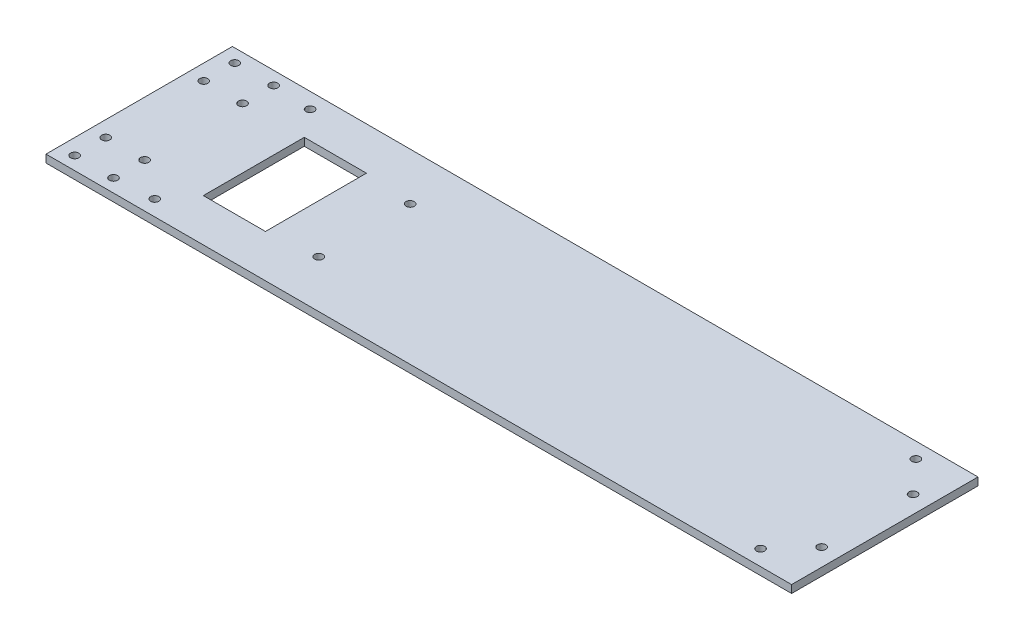
ISO-10303-21;
HEADER;
FILE_DESCRIPTION(('STEP AP214'),'2;1');
FILE_NAME('part.step','',(''),(''),'','','');
FILE_SCHEMA(('AUTOMOTIVE_DESIGN { 1 0 10303 214 1 1 1 1 }'));
ENDSEC;
DATA;
#1=APPLICATION_CONTEXT('core data for automotive mechanical design processes');
#2=APPLICATION_PROTOCOL_DEFINITION('international standard','automotive_design',2000,#1);
#3=PRODUCT_CONTEXT('',#1,'mechanical');
#4=PRODUCT('Part','Part','',(#3));
#5=PRODUCT_RELATED_PRODUCT_CATEGORY('part','',(#4));
#6=PRODUCT_DEFINITION_FORMATION('','',#4);
#7=PRODUCT_DEFINITION_CONTEXT('part definition',#1,'design');
#8=PRODUCT_DEFINITION('design','',#6,#7);
#9=PRODUCT_DEFINITION_SHAPE('','',#8);
#10=(LENGTH_UNIT() NAMED_UNIT(*) SI_UNIT(.MILLI.,.METRE.));
#11=(NAMED_UNIT(*) PLANE_ANGLE_UNIT() SI_UNIT($,.RADIAN.));
#12=(NAMED_UNIT(*) SI_UNIT($,.STERADIAN.) SOLID_ANGLE_UNIT());
#13=UNCERTAINTY_MEASURE_WITH_UNIT(LENGTH_MEASURE(1.E-05),#10,'distance_accuracy_value','');
#14=(GEOMETRIC_REPRESENTATION_CONTEXT(3) GLOBAL_UNCERTAINTY_ASSIGNED_CONTEXT((#13)) GLOBAL_UNIT_ASSIGNED_CONTEXT((#10,
#11,#12)) REPRESENTATION_CONTEXT('',''));
#15=CARTESIAN_POINT('',(0.,0.,0.));
#16=DIRECTION('',(0.,0.,1.));
#17=DIRECTION('',(1.,0.,0.));
#18=AXIS2_PLACEMENT_3D('',#15,#16,#17);
#19=CARTESIAN_POINT('',(0.,6.35,0.));
#20=DIRECTION('',(1.,0.,0.));
#21=DIRECTION('',(0.,0.,-1.));
#22=AXIS2_PLACEMENT_3D('',#19,#20,#21);
#23=PLANE('',#22);
#24=DIRECTION('',(0.,0.,1.));
#25=VECTOR('',#24,1.);
#26=CARTESIAN_POINT('',(0.,0.,0.));
#27=LINE('',#26,#25);
#28=CARTESIAN_POINT('',(0.,0.,-152.4));
#29=VERTEX_POINT('',#28);
#30=CARTESIAN_POINT('',(0.,0.,0.));
#31=VERTEX_POINT('',#30);
#32=EDGE_CURVE('E103',#29,#31,#27,.T.);
#33=ORIENTED_EDGE('',*,*,#32,.T.);
#34=DIRECTION('',(0.,-1.,0.));
#35=VECTOR('',#34,1.);
#36=CARTESIAN_POINT('',(0.,6.35,0.));
#37=LINE('',#36,#35);
#38=CARTESIAN_POINT('',(0.,6.35,0.));
#39=VERTEX_POINT('',#38);
#40=EDGE_CURVE('E11',#39,#31,#37,.T.);
#41=ORIENTED_EDGE('',*,*,#40,.F.);
#42=DIRECTION('',(0.,0.,1.));
#43=VECTOR('',#42,1.);
#44=CARTESIAN_POINT('',(0.,6.35,0.));
#45=LINE('',#44,#43);
#46=CARTESIAN_POINT('',(0.,6.35,-152.4));
#47=VERTEX_POINT('',#46);
#48=EDGE_CURVE('E132',#47,#39,#45,.T.);
#49=ORIENTED_EDGE('',*,*,#48,.F.);
#50=DIRECTION('',(0.,-1.,0.));
#51=VECTOR('',#50,1.);
#52=CARTESIAN_POINT('',(0.,6.35,-152.4));
#53=LINE('',#52,#51);
#54=EDGE_CURVE('E142',#47,#29,#53,.T.);
#55=ORIENTED_EDGE('',*,*,#54,.T.);
#56=EDGE_LOOP('',(#33,#41,#49,#55));
#57=FACE_BOUND('',#56,.T.);
#58=ADVANCED_FACE('F33',(#57),#23,.F.);
#59=CARTESIAN_POINT('',(0.,6.35,0.));
#60=DIRECTION('',(0.,0.,-1.));
#61=DIRECTION('',(-1.,0.,0.));
#62=AXIS2_PLACEMENT_3D('',#59,#60,#61);
#63=PLANE('',#62);
#64=DIRECTION('',(1.,0.,0.));
#65=VECTOR('',#64,1.);
#66=CARTESIAN_POINT('',(0.,0.,0.));
#67=LINE('',#66,#65);
#68=CARTESIAN_POINT('',(609.6,0.,0.));
#69=VERTEX_POINT('',#68);
#70=EDGE_CURVE('E145',#31,#69,#67,.T.);
#71=ORIENTED_EDGE('',*,*,#70,.T.);
#72=DIRECTION('',(0.,-1.,0.));
#73=VECTOR('',#72,1.);
#74=CARTESIAN_POINT('',(609.6,6.35,0.));
#75=LINE('',#74,#73);
#76=CARTESIAN_POINT('',(609.6,6.35,0.));
#77=VERTEX_POINT('',#76);
#78=EDGE_CURVE('E40',#77,#69,#75,.T.);
#79=ORIENTED_EDGE('',*,*,#78,.F.);
#80=DIRECTION('',(1.,0.,0.));
#81=VECTOR('',#80,1.);
#82=CARTESIAN_POINT('',(0.,6.35,0.));
#83=LINE('',#82,#81);
#84=EDGE_CURVE('E135',#39,#77,#83,.T.);
#85=ORIENTED_EDGE('',*,*,#84,.F.);
#86=ORIENTED_EDGE('',*,*,#40,.T.);
#87=EDGE_LOOP('',(#71,#79,#85,#86));
#88=FACE_BOUND('',#87,.T.);
#89=ADVANCED_FACE('F173',(#88),#63,.F.);
#90=CARTESIAN_POINT('',(609.6,6.35,0.));
#91=DIRECTION('',(-1.,0.,0.));
#92=DIRECTION('',(0.,0.,1.));
#93=AXIS2_PLACEMENT_3D('',#90,#91,#92);
#94=PLANE('',#93);
#95=DIRECTION('',(0.,0.,-1.));
#96=VECTOR('',#95,1.);
#97=CARTESIAN_POINT('',(609.6,0.,0.));
#98=LINE('',#97,#96);
#99=CARTESIAN_POINT('',(609.6,0.,-152.4));
#100=VERTEX_POINT('',#99);
#101=EDGE_CURVE('E147',#69,#100,#98,.T.);
#102=ORIENTED_EDGE('',*,*,#101,.T.);
#103=DIRECTION('',(0.,-1.,0.));
#104=VECTOR('',#103,1.);
#105=CARTESIAN_POINT('',(609.6,6.35,-152.4));
#106=LINE('',#105,#104);
#107=CARTESIAN_POINT('',(609.6,6.35,-152.4));
#108=VERTEX_POINT('',#107);
#109=EDGE_CURVE('E152',#108,#100,#106,.T.);
#110=ORIENTED_EDGE('',*,*,#109,.F.);
#111=DIRECTION('',(0.,0.,-1.));
#112=VECTOR('',#111,1.);
#113=CARTESIAN_POINT('',(609.6,6.35,0.));
#114=LINE('',#113,#112);
#115=EDGE_CURVE('E138',#77,#108,#114,.T.);
#116=ORIENTED_EDGE('',*,*,#115,.F.);
#117=ORIENTED_EDGE('',*,*,#78,.T.);
#118=EDGE_LOOP('',(#102,#110,#116,#117));
#119=FACE_BOUND('',#118,.T.);
#120=ADVANCED_FACE('F159',(#119),#94,.F.);
#121=CARTESIAN_POINT('',(0.,6.35,-152.4));
#122=DIRECTION('',(0.,0.,1.));
#123=DIRECTION('',(1.,0.,0.));
#124=AXIS2_PLACEMENT_3D('',#121,#122,#123);
#125=PLANE('',#124);
#126=DIRECTION('',(-1.,0.,0.));
#127=VECTOR('',#126,1.);
#128=CARTESIAN_POINT('',(0.,0.,-152.4));
#129=LINE('',#128,#127);
#130=EDGE_CURVE('E136',#100,#29,#129,.T.);
#131=ORIENTED_EDGE('',*,*,#130,.T.);
#132=ORIENTED_EDGE('',*,*,#54,.F.);
#133=DIRECTION('',(-1.,0.,0.));
#134=VECTOR('',#133,1.);
#135=CARTESIAN_POINT('',(0.,6.35,-152.4));
#136=LINE('',#135,#134);
#137=EDGE_CURVE('E140',#108,#47,#136,.T.);
#138=ORIENTED_EDGE('',*,*,#137,.F.);
#139=ORIENTED_EDGE('',*,*,#109,.T.);
#140=EDGE_LOOP('',(#131,#132,#138,#139));
#141=FACE_BOUND('',#140,.T.);
#142=ADVANCED_FACE('F166',(#141),#125,.F.);
#143=CARTESIAN_POINT('',(0.,6.35,0.));
#144=DIRECTION('',(0.,-1.,0.));
#145=DIRECTION('',(0.,0.,-1.));
#146=AXIS2_PLACEMENT_3D('',#143,#144,#145);
#147=PLANE('',#146);
#148=CARTESIAN_POINT('',(44.45,6.35,-141.65072));
#149=DIRECTION('',(0.,1.,0.));
#150=DIRECTION('',(0.,0.,1.));
#151=AXIS2_PLACEMENT_3D('',#148,#149,#150);
#152=CIRCLE('',#151,3.37819999999998);
#153=CARTESIAN_POINT('',(44.45,6.35,-138.27252));
#154=VERTEX_POINT('',#153);
#155=EDGE_CURVE('E272',#154,#154,#152,.T.);
#156=ORIENTED_EDGE('',*,*,#155,.F.);
#157=EDGE_LOOP('',(#156));
#158=FACE_BOUND('',#157,.T.);
#159=CARTESIAN_POINT('',(44.45,6.35,-116.25072));
#160=DIRECTION('',(0.,1.,0.));
#161=DIRECTION('',(0.,0.,1.));
#162=AXIS2_PLACEMENT_3D('',#159,#160,#161);
#163=CIRCLE('',#162,3.37819999999998);
#164=CARTESIAN_POINT('',(44.45,6.35,-112.87252));
#165=VERTEX_POINT('',#164);
#166=EDGE_CURVE('E274',#165,#165,#163,.T.);
#167=ORIENTED_EDGE('',*,*,#166,.F.);
#168=EDGE_LOOP('',(#167));
#169=FACE_BOUND('',#168,.T.);
#170=CARTESIAN_POINT('',(12.7,6.35,-116.25072));
#171=DIRECTION('',(0.,1.,0.));
#172=DIRECTION('',(0.,0.,1.));
#173=AXIS2_PLACEMENT_3D('',#170,#171,#172);
#174=CIRCLE('',#173,3.37820000000002);
#175=CARTESIAN_POINT('',(12.7,6.35,-112.87252));
#176=VERTEX_POINT('',#175);
#177=EDGE_CURVE('E280',#176,#176,#174,.T.);
#178=ORIENTED_EDGE('',*,*,#177,.F.);
#179=EDGE_LOOP('',(#178));
#180=FACE_BOUND('',#179,.T.);
#181=CARTESIAN_POINT('',(12.7,6.35,-141.65072));
#182=DIRECTION('',(0.,1.,0.));
#183=DIRECTION('',(0.,0.,1.));
#184=AXIS2_PLACEMENT_3D('',#181,#182,#183);
#185=CIRCLE('',#184,3.37819999999999);
#186=CARTESIAN_POINT('',(12.7,6.35,-138.27252));
#187=VERTEX_POINT('',#186);
#188=EDGE_CURVE('E286',#187,#187,#185,.T.);
#189=ORIENTED_EDGE('',*,*,#188,.F.);
#190=EDGE_LOOP('',(#189));
#191=FACE_BOUND('',#190,.T.);
#192=CARTESIAN_POINT('',(44.45,6.35,-36.14928));
#193=DIRECTION('',(0.,1.,0.));
#194=DIRECTION('',(0.,0.,1.));
#195=AXIS2_PLACEMENT_3D('',#192,#193,#194);
#196=CIRCLE('',#195,3.3782);
#197=CARTESIAN_POINT('',(44.45,6.35,-32.77108));
#198=VERTEX_POINT('',#197);
#199=EDGE_CURVE('E292',#198,#198,#196,.T.);
#200=ORIENTED_EDGE('',*,*,#199,.F.);
#201=EDGE_LOOP('',(#200));
#202=FACE_BOUND('',#201,.T.);
#203=CARTESIAN_POINT('',(44.45,6.35,-10.74928));
#204=DIRECTION('',(0.,1.,0.));
#205=DIRECTION('',(0.,0.,1.));
#206=AXIS2_PLACEMENT_3D('',#203,#204,#205);
#207=CIRCLE('',#206,3.3782);
#208=CARTESIAN_POINT('',(44.45,6.35,-7.37108000000001));
#209=VERTEX_POINT('',#208);
#210=EDGE_CURVE('E298',#209,#209,#207,.T.);
#211=ORIENTED_EDGE('',*,*,#210,.F.);
#212=EDGE_LOOP('',(#211));
#213=FACE_BOUND('',#212,.T.);
#214=CARTESIAN_POINT('',(12.7,6.35,-10.74928));
#215=DIRECTION('',(0.,1.,0.));
#216=DIRECTION('',(0.,0.,1.));
#217=AXIS2_PLACEMENT_3D('',#214,#215,#216);
#218=CIRCLE('',#217,3.3782);
#219=CARTESIAN_POINT('',(12.7,6.35,-7.37108));
#220=VERTEX_POINT('',#219);
#221=EDGE_CURVE('E304',#220,#220,#218,.T.);
#222=ORIENTED_EDGE('',*,*,#221,.F.);
#223=EDGE_LOOP('',(#222));
#224=FACE_BOUND('',#223,.T.);
#225=CARTESIAN_POINT('',(12.7,6.35,-36.14928));
#226=DIRECTION('',(0.,1.,0.));
#227=DIRECTION('',(0.,0.,1.));
#228=AXIS2_PLACEMENT_3D('',#225,#226,#227);
#229=CIRCLE('',#228,3.3782);
#230=CARTESIAN_POINT('',(12.7,6.35,-32.77108));
#231=VERTEX_POINT('',#230);
#232=EDGE_CURVE('E310',#231,#231,#229,.T.);
#233=ORIENTED_EDGE('',*,*,#232,.F.);
#234=EDGE_LOOP('',(#233));
#235=FACE_BOUND('',#234,.T.);
#236=CARTESIAN_POINT('',(184.15,6.35,-113.587796728268));
#237=DIRECTION('',(0.,1.,0.));
#238=DIRECTION('',(0.,0.,1.));
#239=AXIS2_PLACEMENT_3D('',#236,#237,#238);
#240=CIRCLE('',#239,3.37819999999999);
#241=CARTESIAN_POINT('',(184.15,6.35,-110.209596728268));
#242=VERTEX_POINT('',#241);
#243=EDGE_CURVE('E316',#242,#242,#240,.T.);
#244=ORIENTED_EDGE('',*,*,#243,.F.);
#245=EDGE_LOOP('',(#244));
#246=FACE_BOUND('',#245,.T.);
#247=CARTESIAN_POINT('',(184.15,6.35,-38.812203271732));
#248=DIRECTION('',(0.,1.,0.));
#249=DIRECTION('',(0.,0.,1.));
#250=AXIS2_PLACEMENT_3D('',#247,#248,#249);
#251=CIRCLE('',#250,3.37819999999999);
#252=CARTESIAN_POINT('',(184.15,6.35,-35.434003271732));
#253=VERTEX_POINT('',#252);
#254=EDGE_CURVE('E322',#253,#253,#251,.T.);
#255=ORIENTED_EDGE('',*,*,#254,.F.);
#256=EDGE_LOOP('',(#255));
#257=FACE_BOUND('',#256,.T.);
#258=CARTESIAN_POINT('',(595.3125,6.35,-38.812203271732));
#259=DIRECTION('',(0.,1.,0.));
#260=DIRECTION('',(0.,0.,1.));
#261=AXIS2_PLACEMENT_3D('',#258,#259,#260);
#262=CIRCLE('',#261,3.37819999999999);
#263=CARTESIAN_POINT('',(595.3125,6.35,-35.434003271732));
#264=VERTEX_POINT('',#263);
#265=EDGE_CURVE('E328',#264,#264,#262,.T.);
#266=ORIENTED_EDGE('',*,*,#265,.F.);
#267=EDGE_LOOP('',(#266));
#268=FACE_BOUND('',#267,.T.);
#269=CARTESIAN_POINT('',(595.3125,6.35,-113.587796728268));
#270=DIRECTION('',(0.,1.,0.));
#271=DIRECTION('',(0.,0.,1.));
#272=AXIS2_PLACEMENT_3D('',#269,#270,#271);
#273=CIRCLE('',#272,3.37819999999999);
#274=CARTESIAN_POINT('',(595.3125,6.35,-110.209596728268));
#275=VERTEX_POINT('',#274);
#276=EDGE_CURVE('E334',#275,#275,#273,.T.);
#277=ORIENTED_EDGE('',*,*,#276,.F.);
#278=EDGE_LOOP('',(#277));
#279=FACE_BOUND('',#278,.T.);
#280=CARTESIAN_POINT('',(76.2,6.35,-139.7));
#281=DIRECTION('',(0.,1.,0.));
#282=DIRECTION('',(0.,0.,1.));
#283=AXIS2_PLACEMENT_3D('',#280,#281,#282);
#284=CIRCLE('',#283,3.37819999999999);
#285=CARTESIAN_POINT('',(76.2,6.35,-136.3218));
#286=VERTEX_POINT('',#285);
#287=EDGE_CURVE('E340',#286,#286,#284,.T.);
#288=ORIENTED_EDGE('',*,*,#287,.F.);
#289=EDGE_LOOP('',(#288));
#290=FACE_BOUND('',#289,.T.);
#291=CARTESIAN_POINT('',(76.2,6.35,-12.7));
#292=DIRECTION('',(0.,1.,0.));
#293=DIRECTION('',(0.,0.,1.));
#294=AXIS2_PLACEMENT_3D('',#291,#292,#293);
#295=CIRCLE('',#294,3.37819999999999);
#296=CARTESIAN_POINT('',(76.2,6.35,-9.32180000000001));
#297=VERTEX_POINT('',#296);
#298=EDGE_CURVE('E346',#297,#297,#295,.T.);
#299=ORIENTED_EDGE('',*,*,#298,.F.);
#300=EDGE_LOOP('',(#299));
#301=FACE_BOUND('',#300,.T.);
#302=CARTESIAN_POINT('',(571.5,6.35,-139.7));
#303=DIRECTION('',(0.,1.,0.));
#304=DIRECTION('',(0.,0.,1.));
#305=AXIS2_PLACEMENT_3D('',#302,#303,#304);
#306=CIRCLE('',#305,3.37819999999999);
#307=CARTESIAN_POINT('',(571.5,6.35,-136.3218));
#308=VERTEX_POINT('',#307);
#309=EDGE_CURVE('E352',#308,#308,#306,.T.);
#310=ORIENTED_EDGE('',*,*,#309,.F.);
#311=EDGE_LOOP('',(#310));
#312=FACE_BOUND('',#311,.T.);
#313=CARTESIAN_POINT('',(571.5,6.35,-12.7));
#314=DIRECTION('',(0.,1.,0.));
#315=DIRECTION('',(0.,0.,1.));
#316=AXIS2_PLACEMENT_3D('',#313,#314,#315);
#317=CIRCLE('',#316,3.37819999999999);
#318=CARTESIAN_POINT('',(571.5,6.35,-9.32180000000001));
#319=VERTEX_POINT('',#318);
#320=EDGE_CURVE('E358',#319,#319,#317,.T.);
#321=ORIENTED_EDGE('',*,*,#320,.F.);
#322=EDGE_LOOP('',(#321));
#323=FACE_BOUND('',#322,.T.);
#324=DIRECTION('',(-1.,0.,0.));
#325=VECTOR('',#324,1.);
#326=CARTESIAN_POINT('',(144.5006,6.35,-117.475));
#327=LINE('',#326,#325);
#328=CARTESIAN_POINT('',(144.5006,6.35,-117.475));
#329=VERTEX_POINT('',#328);
#330=CARTESIAN_POINT('',(93.7006,6.35,-117.475));
#331=VERTEX_POINT('',#330);
#332=EDGE_CURVE('E116',#329,#331,#327,.T.);
#333=ORIENTED_EDGE('',*,*,#332,.F.);
#334=DIRECTION('',(0.,0.,-1.));
#335=VECTOR('',#334,1.);
#336=CARTESIAN_POINT('',(144.5006,6.35,-34.925));
#337=LINE('',#336,#335);
#338=CARTESIAN_POINT('',(144.5006,6.35,-34.925));
#339=VERTEX_POINT('',#338);
#340=EDGE_CURVE('E47',#339,#329,#337,.T.);
#341=ORIENTED_EDGE('',*,*,#340,.F.);
#342=DIRECTION('',(1.,0.,0.));
#343=VECTOR('',#342,1.);
#344=CARTESIAN_POINT('',(144.5006,6.35,-34.925));
#345=LINE('',#344,#343);
#346=CARTESIAN_POINT('',(93.7006,6.35,-34.925));
#347=VERTEX_POINT('',#346);
#348=EDGE_CURVE('E109',#347,#339,#345,.T.);
#349=ORIENTED_EDGE('',*,*,#348,.F.);
#350=DIRECTION('',(0.,0.,1.));
#351=VECTOR('',#350,1.);
#352=CARTESIAN_POINT('',(93.7006,6.35,-34.925));
#353=LINE('',#352,#351);
#354=EDGE_CURVE('E123',#331,#347,#353,.T.);
#355=ORIENTED_EDGE('',*,*,#354,.F.);
#356=EDGE_LOOP('',(#333,#341,#349,#355));
#357=FACE_BOUND('',#356,.T.);
#358=ORIENTED_EDGE('',*,*,#48,.T.);
#359=ORIENTED_EDGE('',*,*,#84,.T.);
#360=ORIENTED_EDGE('',*,*,#115,.T.);
#361=ORIENTED_EDGE('',*,*,#137,.T.);
#362=EDGE_LOOP('',(#358,#359,#360,#361));
#363=FACE_BOUND('',#362,.T.);
#364=ADVANCED_FACE('F172',(#158,#169,#180,#191,#202,#213,#224,#235,#246,#257,#268,#279,#290,
#301,#312,#323,#357,#363),#147,.F.);
#365=CARTESIAN_POINT('',(0.,0.,0.));
#366=DIRECTION('',(0.,-1.,0.));
#367=DIRECTION('',(0.,0.,-1.));
#368=AXIS2_PLACEMENT_3D('',#365,#366,#367);
#369=PLANE('',#368);
#370=CARTESIAN_POINT('',(44.45,0.,-141.65072));
#371=DIRECTION('',(0.,1.,0.));
#372=DIRECTION('',(0.,0.,1.));
#373=AXIS2_PLACEMENT_3D('',#370,#371,#372);
#374=CIRCLE('',#373,3.37819999999998);
#375=CARTESIAN_POINT('',(44.45,0.,-138.27252));
#376=VERTEX_POINT('',#375);
#377=EDGE_CURVE('E269',#376,#376,#374,.T.);
#378=ORIENTED_EDGE('',*,*,#377,.T.);
#379=EDGE_LOOP('',(#378));
#380=FACE_BOUND('',#379,.T.);
#381=CARTESIAN_POINT('',(44.45,0.,-116.25072));
#382=DIRECTION('',(0.,1.,0.));
#383=DIRECTION('',(0.,0.,1.));
#384=AXIS2_PLACEMENT_3D('',#381,#382,#383);
#385=CIRCLE('',#384,3.37819999999998);
#386=CARTESIAN_POINT('',(44.45,0.,-112.87252));
#387=VERTEX_POINT('',#386);
#388=EDGE_CURVE('E277',#387,#387,#385,.T.);
#389=ORIENTED_EDGE('',*,*,#388,.T.);
#390=EDGE_LOOP('',(#389));
#391=FACE_BOUND('',#390,.T.);
#392=CARTESIAN_POINT('',(12.7,0.,-116.25072));
#393=DIRECTION('',(0.,1.,0.));
#394=DIRECTION('',(0.,0.,1.));
#395=AXIS2_PLACEMENT_3D('',#392,#393,#394);
#396=CIRCLE('',#395,3.37820000000002);
#397=CARTESIAN_POINT('',(12.7,0.,-112.87252));
#398=VERTEX_POINT('',#397);
#399=EDGE_CURVE('E283',#398,#398,#396,.T.);
#400=ORIENTED_EDGE('',*,*,#399,.T.);
#401=EDGE_LOOP('',(#400));
#402=FACE_BOUND('',#401,.T.);
#403=CARTESIAN_POINT('',(12.7,0.,-141.65072));
#404=DIRECTION('',(0.,1.,0.));
#405=DIRECTION('',(0.,0.,1.));
#406=AXIS2_PLACEMENT_3D('',#403,#404,#405);
#407=CIRCLE('',#406,3.37819999999999);
#408=CARTESIAN_POINT('',(12.7,0.,-138.27252));
#409=VERTEX_POINT('',#408);
#410=EDGE_CURVE('E289',#409,#409,#407,.T.);
#411=ORIENTED_EDGE('',*,*,#410,.T.);
#412=EDGE_LOOP('',(#411));
#413=FACE_BOUND('',#412,.T.);
#414=CARTESIAN_POINT('',(44.45,0.,-36.14928));
#415=DIRECTION('',(0.,1.,0.));
#416=DIRECTION('',(0.,0.,1.));
#417=AXIS2_PLACEMENT_3D('',#414,#415,#416);
#418=CIRCLE('',#417,3.3782);
#419=CARTESIAN_POINT('',(44.45,0.,-32.77108));
#420=VERTEX_POINT('',#419);
#421=EDGE_CURVE('E295',#420,#420,#418,.T.);
#422=ORIENTED_EDGE('',*,*,#421,.T.);
#423=EDGE_LOOP('',(#422));
#424=FACE_BOUND('',#423,.T.);
#425=CARTESIAN_POINT('',(44.45,0.,-10.74928));
#426=DIRECTION('',(0.,1.,0.));
#427=DIRECTION('',(0.,0.,1.));
#428=AXIS2_PLACEMENT_3D('',#425,#426,#427);
#429=CIRCLE('',#428,3.3782);
#430=CARTESIAN_POINT('',(44.45,0.,-7.37108000000001));
#431=VERTEX_POINT('',#430);
#432=EDGE_CURVE('E301',#431,#431,#429,.T.);
#433=ORIENTED_EDGE('',*,*,#432,.T.);
#434=EDGE_LOOP('',(#433));
#435=FACE_BOUND('',#434,.T.);
#436=CARTESIAN_POINT('',(12.7,0.,-10.74928));
#437=DIRECTION('',(0.,1.,0.));
#438=DIRECTION('',(0.,0.,1.));
#439=AXIS2_PLACEMENT_3D('',#436,#437,#438);
#440=CIRCLE('',#439,3.3782);
#441=CARTESIAN_POINT('',(12.7,0.,-7.37108));
#442=VERTEX_POINT('',#441);
#443=EDGE_CURVE('E307',#442,#442,#440,.T.);
#444=ORIENTED_EDGE('',*,*,#443,.T.);
#445=EDGE_LOOP('',(#444));
#446=FACE_BOUND('',#445,.T.);
#447=CARTESIAN_POINT('',(12.7,0.,-36.14928));
#448=DIRECTION('',(0.,1.,0.));
#449=DIRECTION('',(0.,0.,1.));
#450=AXIS2_PLACEMENT_3D('',#447,#448,#449);
#451=CIRCLE('',#450,3.3782);
#452=CARTESIAN_POINT('',(12.7,0.,-32.77108));
#453=VERTEX_POINT('',#452);
#454=EDGE_CURVE('E313',#453,#453,#451,.T.);
#455=ORIENTED_EDGE('',*,*,#454,.T.);
#456=EDGE_LOOP('',(#455));
#457=FACE_BOUND('',#456,.T.);
#458=CARTESIAN_POINT('',(184.15,0.,-113.587796728268));
#459=DIRECTION('',(0.,1.,0.));
#460=DIRECTION('',(0.,0.,1.));
#461=AXIS2_PLACEMENT_3D('',#458,#459,#460);
#462=CIRCLE('',#461,3.37819999999999);
#463=CARTESIAN_POINT('',(184.15,0.,-110.209596728268));
#464=VERTEX_POINT('',#463);
#465=EDGE_CURVE('E319',#464,#464,#462,.T.);
#466=ORIENTED_EDGE('',*,*,#465,.T.);
#467=EDGE_LOOP('',(#466));
#468=FACE_BOUND('',#467,.T.);
#469=CARTESIAN_POINT('',(184.15,0.,-38.812203271732));
#470=DIRECTION('',(0.,1.,0.));
#471=DIRECTION('',(0.,0.,1.));
#472=AXIS2_PLACEMENT_3D('',#469,#470,#471);
#473=CIRCLE('',#472,3.37819999999999);
#474=CARTESIAN_POINT('',(184.15,0.,-35.434003271732));
#475=VERTEX_POINT('',#474);
#476=EDGE_CURVE('E325',#475,#475,#473,.T.);
#477=ORIENTED_EDGE('',*,*,#476,.T.);
#478=EDGE_LOOP('',(#477));
#479=FACE_BOUND('',#478,.T.);
#480=CARTESIAN_POINT('',(595.3125,0.,-38.812203271732));
#481=DIRECTION('',(0.,1.,0.));
#482=DIRECTION('',(0.,0.,1.));
#483=AXIS2_PLACEMENT_3D('',#480,#481,#482);
#484=CIRCLE('',#483,3.37819999999999);
#485=CARTESIAN_POINT('',(595.3125,0.,-35.434003271732));
#486=VERTEX_POINT('',#485);
#487=EDGE_CURVE('E331',#486,#486,#484,.T.);
#488=ORIENTED_EDGE('',*,*,#487,.T.);
#489=EDGE_LOOP('',(#488));
#490=FACE_BOUND('',#489,.T.);
#491=CARTESIAN_POINT('',(595.3125,0.,-113.587796728268));
#492=DIRECTION('',(0.,1.,0.));
#493=DIRECTION('',(0.,0.,1.));
#494=AXIS2_PLACEMENT_3D('',#491,#492,#493);
#495=CIRCLE('',#494,3.37819999999999);
#496=CARTESIAN_POINT('',(595.3125,0.,-110.209596728268));
#497=VERTEX_POINT('',#496);
#498=EDGE_CURVE('E337',#497,#497,#495,.T.);
#499=ORIENTED_EDGE('',*,*,#498,.T.);
#500=EDGE_LOOP('',(#499));
#501=FACE_BOUND('',#500,.T.);
#502=CARTESIAN_POINT('',(76.2,0.,-139.7));
#503=DIRECTION('',(0.,1.,0.));
#504=DIRECTION('',(0.,0.,1.));
#505=AXIS2_PLACEMENT_3D('',#502,#503,#504);
#506=CIRCLE('',#505,3.37819999999999);
#507=CARTESIAN_POINT('',(76.2,0.,-136.3218));
#508=VERTEX_POINT('',#507);
#509=EDGE_CURVE('E343',#508,#508,#506,.T.);
#510=ORIENTED_EDGE('',*,*,#509,.T.);
#511=EDGE_LOOP('',(#510));
#512=FACE_BOUND('',#511,.T.);
#513=CARTESIAN_POINT('',(76.2,0.,-12.7));
#514=DIRECTION('',(0.,1.,0.));
#515=DIRECTION('',(0.,0.,1.));
#516=AXIS2_PLACEMENT_3D('',#513,#514,#515);
#517=CIRCLE('',#516,3.37819999999999);
#518=CARTESIAN_POINT('',(76.2,0.,-9.32180000000001));
#519=VERTEX_POINT('',#518);
#520=EDGE_CURVE('E349',#519,#519,#517,.T.);
#521=ORIENTED_EDGE('',*,*,#520,.T.);
#522=EDGE_LOOP('',(#521));
#523=FACE_BOUND('',#522,.T.);
#524=CARTESIAN_POINT('',(571.5,0.,-139.7));
#525=DIRECTION('',(0.,1.,0.));
#526=DIRECTION('',(0.,0.,1.));
#527=AXIS2_PLACEMENT_3D('',#524,#525,#526);
#528=CIRCLE('',#527,3.37819999999999);
#529=CARTESIAN_POINT('',(571.5,0.,-136.3218));
#530=VERTEX_POINT('',#529);
#531=EDGE_CURVE('E355',#530,#530,#528,.T.);
#532=ORIENTED_EDGE('',*,*,#531,.T.);
#533=EDGE_LOOP('',(#532));
#534=FACE_BOUND('',#533,.T.);
#535=CARTESIAN_POINT('',(571.5,0.,-12.7));
#536=DIRECTION('',(0.,1.,0.));
#537=DIRECTION('',(0.,0.,1.));
#538=AXIS2_PLACEMENT_3D('',#535,#536,#537);
#539=CIRCLE('',#538,3.37819999999999);
#540=CARTESIAN_POINT('',(571.5,0.,-9.32180000000001));
#541=VERTEX_POINT('',#540);
#542=EDGE_CURVE('E361',#541,#541,#539,.T.);
#543=ORIENTED_EDGE('',*,*,#542,.T.);
#544=EDGE_LOOP('',(#543));
#545=FACE_BOUND('',#544,.T.);
#546=DIRECTION('',(0.,0.,-1.));
#547=VECTOR('',#546,1.);
#548=CARTESIAN_POINT('',(144.5006,0.,-34.925));
#549=LINE('',#548,#547);
#550=CARTESIAN_POINT('',(144.5006,0.,-34.925));
#551=VERTEX_POINT('',#550);
#552=CARTESIAN_POINT('',(144.5006,0.,-117.475));
#553=VERTEX_POINT('',#552);
#554=EDGE_CURVE('E107',#551,#553,#549,.T.);
#555=ORIENTED_EDGE('',*,*,#554,.T.);
#556=DIRECTION('',(-1.,0.,0.));
#557=VECTOR('',#556,1.);
#558=CARTESIAN_POINT('',(144.5006,0.,-117.475));
#559=LINE('',#558,#557);
#560=CARTESIAN_POINT('',(93.7006,0.,-117.475));
#561=VERTEX_POINT('',#560);
#562=EDGE_CURVE('E96',#553,#561,#559,.T.);
#563=ORIENTED_EDGE('',*,*,#562,.T.);
#564=DIRECTION('',(0.,0.,1.));
#565=VECTOR('',#564,1.);
#566=CARTESIAN_POINT('',(93.7006,0.,-34.925));
#567=LINE('',#566,#565);
#568=CARTESIAN_POINT('',(93.7006,0.,-34.925));
#569=VERTEX_POINT('',#568);
#570=EDGE_CURVE('E118',#561,#569,#567,.T.);
#571=ORIENTED_EDGE('',*,*,#570,.T.);
#572=DIRECTION('',(1.,0.,0.));
#573=VECTOR('',#572,1.);
#574=CARTESIAN_POINT('',(144.5006,0.,-34.925));
#575=LINE('',#574,#573);
#576=EDGE_CURVE('E114',#569,#551,#575,.T.);
#577=ORIENTED_EDGE('',*,*,#576,.T.);
#578=EDGE_LOOP('',(#555,#563,#571,#577));
#579=FACE_BOUND('',#578,.T.);
#580=ORIENTED_EDGE('',*,*,#32,.F.);
#581=ORIENTED_EDGE('',*,*,#130,.F.);
#582=ORIENTED_EDGE('',*,*,#101,.F.);
#583=ORIENTED_EDGE('',*,*,#70,.F.);
#584=EDGE_LOOP('',(#580,#581,#582,#583));
#585=FACE_BOUND('',#584,.T.);
#586=ADVANCED_FACE('F112',(#380,#391,#402,#413,#424,#435,#446,#457,#468,#479,#490,#501,#512,
#523,#534,#545,#579,#585),#369,.T.);
#587=CARTESIAN_POINT('',(144.5006,-0.00100000000000013,-34.925));
#588=DIRECTION('',(1.,0.,0.));
#589=DIRECTION('',(0.,0.,-1.));
#590=AXIS2_PLACEMENT_3D('',#587,#588,#589);
#591=PLANE('',#590);
#592=DIRECTION('',(0.,1.,0.));
#593=VECTOR('',#592,1.);
#594=CARTESIAN_POINT('',(144.5006,-0.00100000000000013,-34.925));
#595=LINE('',#594,#593);
#596=EDGE_CURVE('E104',#551,#339,#595,.T.);
#597=ORIENTED_EDGE('',*,*,#596,.T.);
#598=ORIENTED_EDGE('',*,*,#340,.T.);
#599=DIRECTION('',(0.,1.,0.));
#600=VECTOR('',#599,1.);
#601=CARTESIAN_POINT('',(144.5006,-0.00100000000000013,-117.475));
#602=LINE('',#601,#600);
#603=EDGE_CURVE('E98',#553,#329,#602,.T.);
#604=ORIENTED_EDGE('',*,*,#603,.F.);
#605=ORIENTED_EDGE('',*,*,#554,.F.);
#606=EDGE_LOOP('',(#597,#598,#604,#605));
#607=FACE_BOUND('',#606,.T.);
#608=ADVANCED_FACE('F106',(#607),#591,.F.);
#609=CARTESIAN_POINT('',(144.5006,-0.00100000000000013,-34.925));
#610=DIRECTION('',(0.,0.,1.));
#611=DIRECTION('',(1.,0.,0.));
#612=AXIS2_PLACEMENT_3D('',#609,#610,#611);
#613=PLANE('',#612);
#614=DIRECTION('',(0.,1.,0.));
#615=VECTOR('',#614,1.);
#616=CARTESIAN_POINT('',(93.7006,-0.00100000000000013,-34.925));
#617=LINE('',#616,#615);
#618=EDGE_CURVE('E129',#569,#347,#617,.T.);
#619=ORIENTED_EDGE('',*,*,#618,.T.);
#620=ORIENTED_EDGE('',*,*,#348,.T.);
#621=ORIENTED_EDGE('',*,*,#596,.F.);
#622=ORIENTED_EDGE('',*,*,#576,.F.);
#623=EDGE_LOOP('',(#619,#620,#621,#622));
#624=FACE_BOUND('',#623,.T.);
#625=ADVANCED_FACE('F191',(#624),#613,.F.);
#626=CARTESIAN_POINT('',(93.7006,-0.00100000000000013,-34.925));
#627=DIRECTION('',(-1.,0.,0.));
#628=DIRECTION('',(0.,0.,1.));
#629=AXIS2_PLACEMENT_3D('',#626,#627,#628);
#630=PLANE('',#629);
#631=DIRECTION('',(0.,1.,0.));
#632=VECTOR('',#631,1.);
#633=CARTESIAN_POINT('',(93.7006,-0.00100000000000013,-117.475));
#634=LINE('',#633,#632);
#635=EDGE_CURVE('E55',#561,#331,#634,.T.);
#636=ORIENTED_EDGE('',*,*,#635,.T.);
#637=ORIENTED_EDGE('',*,*,#354,.T.);
#638=ORIENTED_EDGE('',*,*,#618,.F.);
#639=ORIENTED_EDGE('',*,*,#570,.F.);
#640=EDGE_LOOP('',(#636,#637,#638,#639));
#641=FACE_BOUND('',#640,.T.);
#642=ADVANCED_FACE('F195',(#641),#630,.F.);
#643=CARTESIAN_POINT('',(144.5006,-0.00100000000000013,-117.475));
#644=DIRECTION('',(0.,0.,-1.));
#645=DIRECTION('',(-1.,0.,0.));
#646=AXIS2_PLACEMENT_3D('',#643,#644,#645);
#647=PLANE('',#646);
#648=ORIENTED_EDGE('',*,*,#603,.T.);
#649=ORIENTED_EDGE('',*,*,#332,.T.);
#650=ORIENTED_EDGE('',*,*,#635,.F.);
#651=ORIENTED_EDGE('',*,*,#562,.F.);
#652=EDGE_LOOP('',(#648,#649,#650,#651));
#653=FACE_BOUND('',#652,.T.);
#654=ADVANCED_FACE('F97',(#653),#647,.F.);
#655=CARTESIAN_POINT('',(571.5,0.,-12.7));
#656=DIRECTION('',(0.,1.,0.));
#657=DIRECTION('',(0.,0.,1.));
#658=AXIS2_PLACEMENT_3D('',#655,#656,#657);
#659=CYLINDRICAL_SURFACE('',#658,3.37819999999999);
#660=ORIENTED_EDGE('',*,*,#542,.F.);
#661=EDGE_LOOP('',(#660));
#662=FACE_BOUND('',#661,.T.);
#663=ORIENTED_EDGE('',*,*,#320,.T.);
#664=EDGE_LOOP('',(#663));
#665=FACE_BOUND('',#664,.T.);
#666=ADVANCED_FACE('F194',(#662,#665),#659,.F.);
#667=CARTESIAN_POINT('',(571.5,0.,-139.7));
#668=DIRECTION('',(0.,1.,0.));
#669=DIRECTION('',(0.,0.,1.));
#670=AXIS2_PLACEMENT_3D('',#667,#668,#669);
#671=CYLINDRICAL_SURFACE('',#670,3.37819999999999);
#672=ORIENTED_EDGE('',*,*,#531,.F.);
#673=EDGE_LOOP('',(#672));
#674=FACE_BOUND('',#673,.T.);
#675=ORIENTED_EDGE('',*,*,#309,.T.);
#676=EDGE_LOOP('',(#675));
#677=FACE_BOUND('',#676,.T.);
#678=ADVANCED_FACE('F204',(#674,#677),#671,.F.);
#679=CARTESIAN_POINT('',(76.2,0.,-12.7));
#680=DIRECTION('',(0.,1.,0.));
#681=DIRECTION('',(0.,0.,1.));
#682=AXIS2_PLACEMENT_3D('',#679,#680,#681);
#683=CYLINDRICAL_SURFACE('',#682,3.37819999999999);
#684=ORIENTED_EDGE('',*,*,#520,.F.);
#685=EDGE_LOOP('',(#684));
#686=FACE_BOUND('',#685,.T.);
#687=ORIENTED_EDGE('',*,*,#298,.T.);
#688=EDGE_LOOP('',(#687));
#689=FACE_BOUND('',#688,.T.);
#690=ADVANCED_FACE('F208',(#686,#689),#683,.F.);
#691=CARTESIAN_POINT('',(76.2,0.,-139.7));
#692=DIRECTION('',(0.,1.,0.));
#693=DIRECTION('',(0.,0.,1.));
#694=AXIS2_PLACEMENT_3D('',#691,#692,#693);
#695=CYLINDRICAL_SURFACE('',#694,3.37819999999999);
#696=ORIENTED_EDGE('',*,*,#509,.F.);
#697=EDGE_LOOP('',(#696));
#698=FACE_BOUND('',#697,.T.);
#699=ORIENTED_EDGE('',*,*,#287,.T.);
#700=EDGE_LOOP('',(#699));
#701=FACE_BOUND('',#700,.T.);
#702=ADVANCED_FACE('F212',(#698,#701),#695,.F.);
#703=CARTESIAN_POINT('',(595.3125,0.,-113.587796728268));
#704=DIRECTION('',(0.,1.,0.));
#705=DIRECTION('',(0.,0.,1.));
#706=AXIS2_PLACEMENT_3D('',#703,#704,#705);
#707=CYLINDRICAL_SURFACE('',#706,3.37819999999999);
#708=ORIENTED_EDGE('',*,*,#498,.F.);
#709=EDGE_LOOP('',(#708));
#710=FACE_BOUND('',#709,.T.);
#711=ORIENTED_EDGE('',*,*,#276,.T.);
#712=EDGE_LOOP('',(#711));
#713=FACE_BOUND('',#712,.T.);
#714=ADVANCED_FACE('F216',(#710,#713),#707,.F.);
#715=CARTESIAN_POINT('',(595.3125,0.,-38.812203271732));
#716=DIRECTION('',(0.,1.,0.));
#717=DIRECTION('',(0.,0.,1.));
#718=AXIS2_PLACEMENT_3D('',#715,#716,#717);
#719=CYLINDRICAL_SURFACE('',#718,3.37819999999999);
#720=ORIENTED_EDGE('',*,*,#487,.F.);
#721=EDGE_LOOP('',(#720));
#722=FACE_BOUND('',#721,.T.);
#723=ORIENTED_EDGE('',*,*,#265,.T.);
#724=EDGE_LOOP('',(#723));
#725=FACE_BOUND('',#724,.T.);
#726=ADVANCED_FACE('F220',(#722,#725),#719,.F.);
#727=CARTESIAN_POINT('',(184.15,0.,-38.812203271732));
#728=DIRECTION('',(0.,1.,0.));
#729=DIRECTION('',(0.,0.,1.));
#730=AXIS2_PLACEMENT_3D('',#727,#728,#729);
#731=CYLINDRICAL_SURFACE('',#730,3.37819999999999);
#732=ORIENTED_EDGE('',*,*,#476,.F.);
#733=EDGE_LOOP('',(#732));
#734=FACE_BOUND('',#733,.T.);
#735=ORIENTED_EDGE('',*,*,#254,.T.);
#736=EDGE_LOOP('',(#735));
#737=FACE_BOUND('',#736,.T.);
#738=ADVANCED_FACE('F224',(#734,#737),#731,.F.);
#739=CARTESIAN_POINT('',(184.15,0.,-113.587796728268));
#740=DIRECTION('',(0.,1.,0.));
#741=DIRECTION('',(0.,0.,1.));
#742=AXIS2_PLACEMENT_3D('',#739,#740,#741);
#743=CYLINDRICAL_SURFACE('',#742,3.37819999999999);
#744=ORIENTED_EDGE('',*,*,#465,.F.);
#745=EDGE_LOOP('',(#744));
#746=FACE_BOUND('',#745,.T.);
#747=ORIENTED_EDGE('',*,*,#243,.T.);
#748=EDGE_LOOP('',(#747));
#749=FACE_BOUND('',#748,.T.);
#750=ADVANCED_FACE('F228',(#746,#749),#743,.F.);
#751=CARTESIAN_POINT('',(12.7,0.,-36.14928));
#752=DIRECTION('',(0.,1.,0.));
#753=DIRECTION('',(0.,0.,1.));
#754=AXIS2_PLACEMENT_3D('',#751,#752,#753);
#755=CYLINDRICAL_SURFACE('',#754,3.3782);
#756=ORIENTED_EDGE('',*,*,#454,.F.);
#757=EDGE_LOOP('',(#756));
#758=FACE_BOUND('',#757,.T.);
#759=ORIENTED_EDGE('',*,*,#232,.T.);
#760=EDGE_LOOP('',(#759));
#761=FACE_BOUND('',#760,.T.);
#762=ADVANCED_FACE('F232',(#758,#761),#755,.F.);
#763=CARTESIAN_POINT('',(12.7,0.,-10.74928));
#764=DIRECTION('',(0.,1.,0.));
#765=DIRECTION('',(0.,0.,1.));
#766=AXIS2_PLACEMENT_3D('',#763,#764,#765);
#767=CYLINDRICAL_SURFACE('',#766,3.3782);
#768=ORIENTED_EDGE('',*,*,#443,.F.);
#769=EDGE_LOOP('',(#768));
#770=FACE_BOUND('',#769,.T.);
#771=ORIENTED_EDGE('',*,*,#221,.T.);
#772=EDGE_LOOP('',(#771));
#773=FACE_BOUND('',#772,.T.);
#774=ADVANCED_FACE('F236',(#770,#773),#767,.F.);
#775=CARTESIAN_POINT('',(44.45,0.,-10.74928));
#776=DIRECTION('',(0.,1.,0.));
#777=DIRECTION('',(0.,0.,1.));
#778=AXIS2_PLACEMENT_3D('',#775,#776,#777);
#779=CYLINDRICAL_SURFACE('',#778,3.3782);
#780=ORIENTED_EDGE('',*,*,#432,.F.);
#781=EDGE_LOOP('',(#780));
#782=FACE_BOUND('',#781,.T.);
#783=ORIENTED_EDGE('',*,*,#210,.T.);
#784=EDGE_LOOP('',(#783));
#785=FACE_BOUND('',#784,.T.);
#786=ADVANCED_FACE('F240',(#782,#785),#779,.F.);
#787=CARTESIAN_POINT('',(44.45,0.,-36.14928));
#788=DIRECTION('',(0.,1.,0.));
#789=DIRECTION('',(0.,0.,1.));
#790=AXIS2_PLACEMENT_3D('',#787,#788,#789);
#791=CYLINDRICAL_SURFACE('',#790,3.3782);
#792=ORIENTED_EDGE('',*,*,#421,.F.);
#793=EDGE_LOOP('',(#792));
#794=FACE_BOUND('',#793,.T.);
#795=ORIENTED_EDGE('',*,*,#199,.T.);
#796=EDGE_LOOP('',(#795));
#797=FACE_BOUND('',#796,.T.);
#798=ADVANCED_FACE('F244',(#794,#797),#791,.F.);
#799=CARTESIAN_POINT('',(12.7,0.,-141.65072));
#800=DIRECTION('',(0.,1.,0.));
#801=DIRECTION('',(0.,0.,1.));
#802=AXIS2_PLACEMENT_3D('',#799,#800,#801);
#803=CYLINDRICAL_SURFACE('',#802,3.37819999999999);
#804=ORIENTED_EDGE('',*,*,#410,.F.);
#805=EDGE_LOOP('',(#804));
#806=FACE_BOUND('',#805,.T.);
#807=ORIENTED_EDGE('',*,*,#188,.T.);
#808=EDGE_LOOP('',(#807));
#809=FACE_BOUND('',#808,.T.);
#810=ADVANCED_FACE('F248',(#806,#809),#803,.F.);
#811=CARTESIAN_POINT('',(12.7,0.,-116.25072));
#812=DIRECTION('',(0.,1.,0.));
#813=DIRECTION('',(0.,0.,1.));
#814=AXIS2_PLACEMENT_3D('',#811,#812,#813);
#815=CYLINDRICAL_SURFACE('',#814,3.37820000000002);
#816=ORIENTED_EDGE('',*,*,#399,.F.);
#817=EDGE_LOOP('',(#816));
#818=FACE_BOUND('',#817,.T.);
#819=ORIENTED_EDGE('',*,*,#177,.T.);
#820=EDGE_LOOP('',(#819));
#821=FACE_BOUND('',#820,.T.);
#822=ADVANCED_FACE('F252',(#818,#821),#815,.F.);
#823=CARTESIAN_POINT('',(44.45,0.,-116.25072));
#824=DIRECTION('',(0.,1.,0.));
#825=DIRECTION('',(0.,0.,1.));
#826=AXIS2_PLACEMENT_3D('',#823,#824,#825);
#827=CYLINDRICAL_SURFACE('',#826,3.37819999999998);
#828=ORIENTED_EDGE('',*,*,#388,.F.);
#829=EDGE_LOOP('',(#828));
#830=FACE_BOUND('',#829,.T.);
#831=ORIENTED_EDGE('',*,*,#166,.T.);
#832=EDGE_LOOP('',(#831));
#833=FACE_BOUND('',#832,.T.);
#834=ADVANCED_FACE('F256',(#830,#833),#827,.F.);
#835=CARTESIAN_POINT('',(44.45,0.,-141.65072));
#836=DIRECTION('',(0.,1.,0.));
#837=DIRECTION('',(0.,0.,1.));
#838=AXIS2_PLACEMENT_3D('',#835,#836,#837);
#839=CYLINDRICAL_SURFACE('',#838,3.37819999999998);
#840=ORIENTED_EDGE('',*,*,#377,.F.);
#841=EDGE_LOOP('',(#840));
#842=FACE_BOUND('',#841,.T.);
#843=ORIENTED_EDGE('',*,*,#155,.T.);
#844=EDGE_LOOP('',(#843));
#845=FACE_BOUND('',#844,.T.);
#846=ADVANCED_FACE('F260',(#842,#845),#839,.F.);
#847=CLOSED_SHELL('',(#58,#89,#120,#142,#364,#586,#608,#625,#642,#654,#666,#678,#690,#702,#714,
#726,#738,#750,#762,#774,#786,#798,#810,#822,#834,#846));
#848=MANIFOLD_SOLID_BREP('B2',#847);
#849=ADVANCED_BREP_SHAPE_REPRESENTATION('',(#18,#848),#14);
#850=SHAPE_DEFINITION_REPRESENTATION(#9,#849);
ENDSEC;
END-ISO-10303-21;
